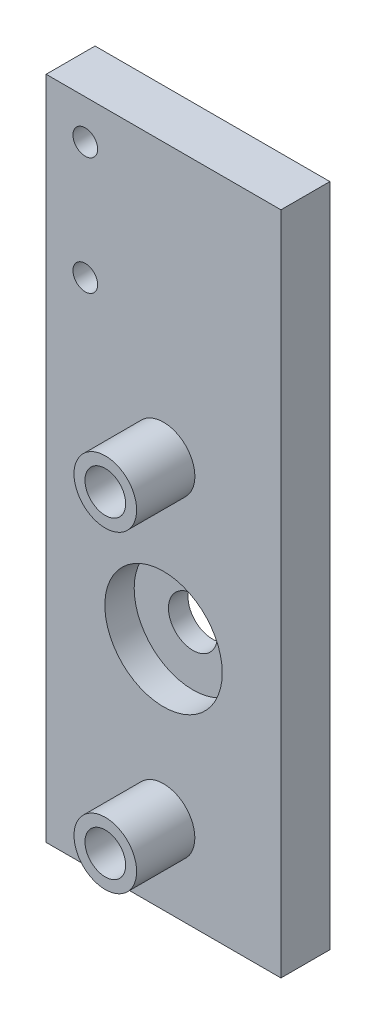
ISO-10303-21;
HEADER;
FILE_DESCRIPTION(('STEP AP214'),'2;1');
FILE_NAME('part.step','',(''),(''),'','','');
FILE_SCHEMA(('AUTOMOTIVE_DESIGN { 1 0 10303 214 1 1 1 1 }'));
ENDSEC;
DATA;
#1=APPLICATION_CONTEXT('core data for automotive mechanical design processes');
#2=APPLICATION_PROTOCOL_DEFINITION('international standard','automotive_design',2000,#1);
#3=PRODUCT_CONTEXT('',#1,'mechanical');
#4=PRODUCT('Part','Part','',(#3));
#5=PRODUCT_RELATED_PRODUCT_CATEGORY('part','',(#4));
#6=PRODUCT_DEFINITION_FORMATION('','',#4);
#7=PRODUCT_DEFINITION_CONTEXT('part definition',#1,'design');
#8=PRODUCT_DEFINITION('design','',#6,#7);
#9=PRODUCT_DEFINITION_SHAPE('','',#8);
#10=(LENGTH_UNIT() NAMED_UNIT(*) SI_UNIT(.MILLI.,.METRE.));
#11=(NAMED_UNIT(*) PLANE_ANGLE_UNIT() SI_UNIT($,.RADIAN.));
#12=(NAMED_UNIT(*) SI_UNIT($,.STERADIAN.) SOLID_ANGLE_UNIT());
#13=UNCERTAINTY_MEASURE_WITH_UNIT(LENGTH_MEASURE(1.E-05),#10,'distance_accuracy_value','');
#14=(GEOMETRIC_REPRESENTATION_CONTEXT(3) GLOBAL_UNCERTAINTY_ASSIGNED_CONTEXT((#13)) GLOBAL_UNIT_ASSIGNED_CONTEXT((#10,
#11,#12)) REPRESENTATION_CONTEXT('',''));
#15=CARTESIAN_POINT('',(0.,0.,0.));
#16=DIRECTION('',(0.,0.,1.));
#17=DIRECTION('',(1.,0.,0.));
#18=AXIS2_PLACEMENT_3D('',#15,#16,#17);
#19=CARTESIAN_POINT('',(19.05,-38.1,7.9375));
#20=DIRECTION('',(-1.,0.,0.));
#21=DIRECTION('',(0.,0.,1.));
#22=AXIS2_PLACEMENT_3D('',#19,#20,#21);
#23=PLANE('',#22);
#24=DIRECTION('',(0.,1.,0.));
#25=VECTOR('',#24,1.);
#26=CARTESIAN_POINT('',(19.05,-38.1,0.));
#27=LINE('',#26,#25);
#28=CARTESIAN_POINT('',(19.05,-38.1,0.));
#29=VERTEX_POINT('',#28);
#30=CARTESIAN_POINT('',(19.05,69.85,0.));
#31=VERTEX_POINT('',#30);
#32=EDGE_CURVE('E77',#29,#31,#27,.T.);
#33=ORIENTED_EDGE('',*,*,#32,.T.);
#34=DIRECTION('',(0.,0.,1.));
#35=VECTOR('',#34,1.);
#36=CARTESIAN_POINT('',(19.05,69.85,-49.5950854420072));
#37=LINE('',#36,#35);
#38=CARTESIAN_POINT('',(19.05,69.85,7.9375));
#39=VERTEX_POINT('',#38);
#40=EDGE_CURVE('E99',#31,#39,#37,.T.);
#41=ORIENTED_EDGE('',*,*,#40,.T.);
#42=DIRECTION('',(0.,1.,0.));
#43=VECTOR('',#42,1.);
#44=CARTESIAN_POINT('',(19.05,-38.1,7.9375));
#45=LINE('',#44,#43);
#46=CARTESIAN_POINT('',(19.05,-38.1,7.9375));
#47=VERTEX_POINT('',#46);
#48=EDGE_CURVE('E91',#47,#39,#45,.T.);
#49=ORIENTED_EDGE('',*,*,#48,.F.);
#50=DIRECTION('',(0.,0.,-1.));
#51=VECTOR('',#50,1.);
#52=CARTESIAN_POINT('',(19.05,-38.1,7.9375));
#53=LINE('',#52,#51);
#54=EDGE_CURVE('E154',#47,#29,#53,.T.);
#55=ORIENTED_EDGE('',*,*,#54,.T.);
#56=EDGE_LOOP('',(#33,#41,#49,#55));
#57=FACE_BOUND('',#56,.T.);
#58=ADVANCED_FACE('F41',(#57),#23,.F.);
#59=CARTESIAN_POINT('',(-19.05,-38.1,7.9375));
#60=DIRECTION('',(1.,0.,0.));
#61=DIRECTION('',(0.,0.,-1.));
#62=AXIS2_PLACEMENT_3D('',#59,#60,#61);
#63=PLANE('',#62);
#64=DIRECTION('',(0.,-1.,0.));
#65=VECTOR('',#64,1.);
#66=CARTESIAN_POINT('',(-19.05,-38.1,0.));
#67=LINE('',#66,#65);
#68=CARTESIAN_POINT('',(-19.05,69.85,0.));
#69=VERTEX_POINT('',#68);
#70=CARTESIAN_POINT('',(-19.05,-38.1,0.));
#71=VERTEX_POINT('',#70);
#72=EDGE_CURVE('E68',#69,#71,#67,.T.);
#73=ORIENTED_EDGE('',*,*,#72,.T.);
#74=DIRECTION('',(0.,0.,-1.));
#75=VECTOR('',#74,1.);
#76=CARTESIAN_POINT('',(-19.05,-38.1,7.9375));
#77=LINE('',#76,#75);
#78=CARTESIAN_POINT('',(-19.05,-38.1,7.9375));
#79=VERTEX_POINT('',#78);
#80=EDGE_CURVE('E49',#79,#71,#77,.T.);
#81=ORIENTED_EDGE('',*,*,#80,.F.);
#82=DIRECTION('',(0.,-1.,0.));
#83=VECTOR('',#82,1.);
#84=CARTESIAN_POINT('',(-19.05,-38.1,7.9375));
#85=LINE('',#84,#83);
#86=CARTESIAN_POINT('',(-19.05,69.85,7.9375));
#87=VERTEX_POINT('',#86);
#88=EDGE_CURVE('E85',#87,#79,#85,.T.);
#89=ORIENTED_EDGE('',*,*,#88,.F.);
#90=DIRECTION('',(0.,0.,1.));
#91=VECTOR('',#90,1.);
#92=CARTESIAN_POINT('',(-19.05,69.85,-49.5950854420072));
#93=LINE('',#92,#91);
#94=EDGE_CURVE('E88',#69,#87,#93,.T.);
#95=ORIENTED_EDGE('',*,*,#94,.F.);
#96=EDGE_LOOP('',(#73,#81,#89,#95));
#97=FACE_BOUND('',#96,.T.);
#98=ADVANCED_FACE('F87',(#97),#63,.F.);
#99=CARTESIAN_POINT('',(-19.05,-38.1,7.9375));
#100=DIRECTION('',(0.,1.,0.));
#101=DIRECTION('',(0.,0.,1.));
#102=AXIS2_PLACEMENT_3D('',#99,#100,#101);
#103=PLANE('',#102);
#104=DIRECTION('',(1.,0.,0.));
#105=VECTOR('',#104,1.);
#106=CARTESIAN_POINT('',(-19.05,-38.1,0.));
#107=LINE('',#106,#105);
#108=EDGE_CURVE('E151',#71,#29,#107,.T.);
#109=ORIENTED_EDGE('',*,*,#108,.T.);
#110=ORIENTED_EDGE('',*,*,#54,.F.);
#111=DIRECTION('',(1.,0.,0.));
#112=VECTOR('',#111,1.);
#113=CARTESIAN_POINT('',(-19.05,-38.1,7.9375));
#114=LINE('',#113,#112);
#115=EDGE_CURVE('E57',#79,#47,#114,.T.);
#116=ORIENTED_EDGE('',*,*,#115,.F.);
#117=ORIENTED_EDGE('',*,*,#80,.T.);
#118=EDGE_LOOP('',(#109,#110,#116,#117));
#119=FACE_BOUND('',#118,.T.);
#120=ADVANCED_FACE('F184',(#119),#103,.F.);
#121=CARTESIAN_POINT('',(0.,0.,7.9375));
#122=DIRECTION('',(0.,0.,-1.));
#123=DIRECTION('',(-1.,0.,0.));
#124=AXIS2_PLACEMENT_3D('',#121,#122,#123);
#125=PLANE('',#124);
#126=CARTESIAN_POINT('',(0.,-25.4,7.9375));
#127=DIRECTION('',(0.,0.,-1.));
#128=DIRECTION('',(1.,0.,0.));
#129=AXIS2_PLACEMENT_3D('',#126,#127,#128);
#130=CIRCLE('',#129,5.08);
#131=CARTESIAN_POINT('',(5.08,-25.4,7.9375));
#132=VERTEX_POINT('',#131);
#133=EDGE_CURVE('E124',#132,#132,#130,.T.);
#134=ORIENTED_EDGE('',*,*,#133,.T.);
#135=EDGE_LOOP('',(#134));
#136=FACE_BOUND('',#135,.T.);
#137=CARTESIAN_POINT('',(0.,25.4,7.9375));
#138=DIRECTION('',(0.,0.,-1.));
#139=DIRECTION('',(-1.,0.,0.));
#140=AXIS2_PLACEMENT_3D('',#137,#138,#139);
#141=CIRCLE('',#140,5.08);
#142=CARTESIAN_POINT('',(-5.08,25.4,7.9375));
#143=VERTEX_POINT('',#142);
#144=EDGE_CURVE('E12',#143,#143,#141,.F.);
#145=ORIENTED_EDGE('',*,*,#144,.F.);
#146=EDGE_LOOP('',(#145));
#147=FACE_BOUND('',#146,.T.);
#148=CARTESIAN_POINT('',(0.,0.,7.9375));
#149=DIRECTION('',(0.,0.,1.));
#150=DIRECTION('',(1.,0.,0.));
#151=AXIS2_PLACEMENT_3D('',#148,#149,#150);
#152=CIRCLE('',#151,9.525);
#153=CARTESIAN_POINT('',(9.525,0.,7.9375));
#154=VERTEX_POINT('',#153);
#155=EDGE_CURVE('E141',#154,#154,#152,.T.);
#156=ORIENTED_EDGE('',*,*,#155,.F.);
#157=EDGE_LOOP('',(#156));
#158=FACE_BOUND('',#157,.T.);
#159=ORIENTED_EDGE('',*,*,#48,.T.);
#160=DIRECTION('',(-1.,0.,0.));
#161=VECTOR('',#160,1.);
#162=CARTESIAN_POINT('',(-19.05,69.85,7.9375));
#163=LINE('',#162,#161);
#164=EDGE_CURVE('E97',#39,#87,#163,.T.);
#165=ORIENTED_EDGE('',*,*,#164,.T.);
#166=ORIENTED_EDGE('',*,*,#88,.T.);
#167=ORIENTED_EDGE('',*,*,#115,.T.);
#168=EDGE_LOOP('',(#159,#165,#166,#167));
#169=FACE_BOUND('',#168,.T.);
#170=CARTESIAN_POINT('',(-12.7,44.45,7.9375));
#171=DIRECTION('',(0.,0.,1.));
#172=DIRECTION('',(-1.,0.,0.));
#173=AXIS2_PLACEMENT_3D('',#170,#171,#172);
#174=CIRCLE('',#173,2.);
#175=CARTESIAN_POINT('',(-14.7,44.45,7.9375));
#176=VERTEX_POINT('',#175);
#177=EDGE_CURVE('E105',#176,#176,#174,.T.);
#178=ORIENTED_EDGE('',*,*,#177,.F.);
#179=EDGE_LOOP('',(#178));
#180=FACE_BOUND('',#179,.T.);
#181=CARTESIAN_POINT('',(-12.7,63.5,7.9375));
#182=DIRECTION('',(0.,0.,1.));
#183=DIRECTION('',(1.,0.,0.));
#184=AXIS2_PLACEMENT_3D('',#181,#182,#183);
#185=CIRCLE('',#184,2.);
#186=CARTESIAN_POINT('',(-10.7,63.5,7.9375));
#187=VERTEX_POINT('',#186);
#188=EDGE_CURVE('E111',#187,#187,#185,.T.);
#189=ORIENTED_EDGE('',*,*,#188,.F.);
#190=EDGE_LOOP('',(#189));
#191=FACE_BOUND('',#190,.T.);
#192=ADVANCED_FACE('F101',(#136,#147,#158,#169,#180,#191),#125,.F.);
#193=CARTESIAN_POINT('',(0.,0.,0.));
#194=DIRECTION('',(0.,0.,-1.));
#195=DIRECTION('',(-1.,0.,0.));
#196=AXIS2_PLACEMENT_3D('',#193,#194,#195);
#197=PLANE('',#196);
#198=CARTESIAN_POINT('',(0.,-25.4,0.));
#199=DIRECTION('',(0.,0.,-1.));
#200=DIRECTION('',(1.,0.,0.));
#201=AXIS2_PLACEMENT_3D('',#198,#199,#200);
#202=CIRCLE('',#201,3.302);
#203=CARTESIAN_POINT('',(3.302,-25.4,0.));
#204=VERTEX_POINT('',#203);
#205=EDGE_CURVE('E121',#204,#204,#202,.T.);
#206=ORIENTED_EDGE('',*,*,#205,.F.);
#207=EDGE_LOOP('',(#206));
#208=FACE_BOUND('',#207,.T.);
#209=CARTESIAN_POINT('',(0.,25.4,0.));
#210=DIRECTION('',(0.,0.,1.));
#211=DIRECTION('',(1.,0.,0.));
#212=AXIS2_PLACEMENT_3D('',#209,#210,#211);
#213=CIRCLE('',#212,3.302);
#214=CARTESIAN_POINT('',(3.302,25.4,0.));
#215=VERTEX_POINT('',#214);
#216=EDGE_CURVE('E133',#215,#215,#213,.T.);
#217=ORIENTED_EDGE('',*,*,#216,.T.);
#218=EDGE_LOOP('',(#217));
#219=FACE_BOUND('',#218,.T.);
#220=CARTESIAN_POINT('',(0.,0.,0.));
#221=DIRECTION('',(0.,0.,1.));
#222=DIRECTION('',(1.,0.,0.));
#223=AXIS2_PLACEMENT_3D('',#220,#221,#222);
#224=CIRCLE('',#223,3.96875);
#225=CARTESIAN_POINT('',(3.96875,0.,0.));
#226=VERTEX_POINT('',#225);
#227=EDGE_CURVE('E148',#226,#226,#224,.T.);
#228=ORIENTED_EDGE('',*,*,#227,.T.);
#229=EDGE_LOOP('',(#228));
#230=FACE_BOUND('',#229,.T.);
#231=ORIENTED_EDGE('',*,*,#32,.F.);
#232=ORIENTED_EDGE('',*,*,#108,.F.);
#233=ORIENTED_EDGE('',*,*,#72,.F.);
#234=DIRECTION('',(-1.,0.,0.));
#235=VECTOR('',#234,1.);
#236=CARTESIAN_POINT('',(-19.05,69.85,0.));
#237=LINE('',#236,#235);
#238=EDGE_CURVE('E98',#31,#69,#237,.T.);
#239=ORIENTED_EDGE('',*,*,#238,.F.);
#240=EDGE_LOOP('',(#231,#232,#233,#239));
#241=FACE_BOUND('',#240,.T.);
#242=CARTESIAN_POINT('',(-12.7,44.45,0.));
#243=DIRECTION('',(0.,0.,-1.));
#244=DIRECTION('',(-1.,0.,0.));
#245=AXIS2_PLACEMENT_3D('',#242,#243,#244);
#246=CIRCLE('',#245,2.);
#247=CARTESIAN_POINT('',(-14.7,44.45,0.));
#248=VERTEX_POINT('',#247);
#249=EDGE_CURVE('E104',#248,#248,#246,.F.);
#250=ORIENTED_EDGE('',*,*,#249,.T.);
#251=EDGE_LOOP('',(#250));
#252=FACE_BOUND('',#251,.T.);
#253=CARTESIAN_POINT('',(-12.7,63.5,0.));
#254=DIRECTION('',(0.,0.,-1.));
#255=DIRECTION('',(-1.,0.,0.));
#256=AXIS2_PLACEMENT_3D('',#253,#254,#255);
#257=CIRCLE('',#256,2.);
#258=CARTESIAN_POINT('',(-14.7,63.5,0.));
#259=VERTEX_POINT('',#258);
#260=EDGE_CURVE('E108',#259,#259,#257,.F.);
#261=ORIENTED_EDGE('',*,*,#260,.T.);
#262=EDGE_LOOP('',(#261));
#263=FACE_BOUND('',#262,.T.);
#264=ADVANCED_FACE('F177',(#208,#219,#230,#241,#252,#263),#197,.T.);
#265=CARTESIAN_POINT('',(0.,0.,0.));
#266=DIRECTION('',(0.,0.,1.));
#267=DIRECTION('',(1.,0.,0.));
#268=AXIS2_PLACEMENT_3D('',#265,#266,#267);
#269=CYLINDRICAL_SURFACE('',#268,3.96875);
#270=CARTESIAN_POINT('',(0.,0.,3.175));
#271=DIRECTION('',(0.,0.,-1.));
#272=DIRECTION('',(-1.,0.,0.));
#273=AXIS2_PLACEMENT_3D('',#270,#271,#272);
#274=CIRCLE('',#273,3.96875);
#275=CARTESIAN_POINT('',(-3.96875,0.,3.175));
#276=VERTEX_POINT('',#275);
#277=EDGE_CURVE('E147',#276,#276,#274,.F.);
#278=ORIENTED_EDGE('',*,*,#277,.T.);
#279=EDGE_LOOP('',(#278));
#280=FACE_BOUND('',#279,.T.);
#281=ORIENTED_EDGE('',*,*,#227,.F.);
#282=EDGE_LOOP('',(#281));
#283=FACE_BOUND('',#282,.T.);
#284=ADVANCED_FACE('F162',(#280,#283),#269,.F.);
#285=CARTESIAN_POINT('',(0.,0.,3.175));
#286=DIRECTION('',(0.,0.,-1.));
#287=DIRECTION('',(-1.,0.,0.));
#288=AXIS2_PLACEMENT_3D('',#285,#286,#287);
#289=PLANE('',#288);
#290=CARTESIAN_POINT('',(0.,0.,3.175));
#291=DIRECTION('',(0.,0.,-1.));
#292=DIRECTION('',(-1.,0.,0.));
#293=AXIS2_PLACEMENT_3D('',#290,#291,#292);
#294=CIRCLE('',#293,9.525);
#295=CARTESIAN_POINT('',(-9.525,0.,3.175));
#296=VERTEX_POINT('',#295);
#297=EDGE_CURVE('E144',#296,#296,#294,.F.);
#298=ORIENTED_EDGE('',*,*,#297,.T.);
#299=EDGE_LOOP('',(#298));
#300=FACE_BOUND('',#299,.T.);
#301=ORIENTED_EDGE('',*,*,#277,.F.);
#302=EDGE_LOOP('',(#301));
#303=FACE_BOUND('',#302,.T.);
#304=ADVANCED_FACE('F165',(#300,#303),#289,.F.);
#305=CARTESIAN_POINT('',(0.,0.,-26.9407683632075));
#306=DIRECTION('',(0.,0.,1.));
#307=DIRECTION('',(1.,0.,0.));
#308=AXIS2_PLACEMENT_3D('',#305,#306,#307);
#309=CYLINDRICAL_SURFACE('',#308,9.525);
#310=ORIENTED_EDGE('',*,*,#155,.T.);
#311=EDGE_LOOP('',(#310));
#312=FACE_BOUND('',#311,.T.);
#313=ORIENTED_EDGE('',*,*,#297,.F.);
#314=EDGE_LOOP('',(#313));
#315=FACE_BOUND('',#314,.T.);
#316=ADVANCED_FACE('F167',(#312,#315),#309,.F.);
#317=CARTESIAN_POINT('',(0.,25.4,17.3863));
#318=DIRECTION('',(0.,0.,-1.));
#319=DIRECTION('',(-1.,0.,0.));
#320=AXIS2_PLACEMENT_3D('',#317,#318,#319);
#321=CYLINDRICAL_SURFACE('',#320,5.08);
#322=CARTESIAN_POINT('',(0.,25.4,17.3863));
#323=DIRECTION('',(0.,0.,1.));
#324=DIRECTION('',(1.,0.,0.));
#325=AXIS2_PLACEMENT_3D('',#322,#323,#324);
#326=CIRCLE('',#325,5.08);
#327=CARTESIAN_POINT('',(5.08,25.4,17.3863));
#328=VERTEX_POINT('',#327);
#329=EDGE_CURVE('E136',#328,#328,#326,.T.);
#330=ORIENTED_EDGE('',*,*,#329,.F.);
#331=EDGE_LOOP('',(#330));
#332=FACE_BOUND('',#331,.T.);
#333=ORIENTED_EDGE('',*,*,#144,.T.);
#334=EDGE_LOOP('',(#333));
#335=FACE_BOUND('',#334,.T.);
#336=ADVANCED_FACE('F174',(#332,#335),#321,.T.);
#337=CARTESIAN_POINT('',(0.,25.4,17.3863));
#338=DIRECTION('',(0.,0.,1.));
#339=DIRECTION('',(1.,0.,0.));
#340=AXIS2_PLACEMENT_3D('',#337,#338,#339);
#341=PLANE('',#340);
#342=CARTESIAN_POINT('',(0.,25.4,17.3863));
#343=DIRECTION('',(0.,0.,1.));
#344=DIRECTION('',(1.,0.,0.));
#345=AXIS2_PLACEMENT_3D('',#342,#343,#344);
#346=CIRCLE('',#345,3.302);
#347=CARTESIAN_POINT('',(3.302,25.4,17.3863));
#348=VERTEX_POINT('',#347);
#349=EDGE_CURVE('E130',#348,#348,#346,.T.);
#350=ORIENTED_EDGE('',*,*,#349,.F.);
#351=EDGE_LOOP('',(#350));
#352=FACE_BOUND('',#351,.T.);
#353=ORIENTED_EDGE('',*,*,#329,.T.);
#354=EDGE_LOOP('',(#353));
#355=FACE_BOUND('',#354,.T.);
#356=ADVANCED_FACE('F207',(#352,#355),#341,.T.);
#357=CARTESIAN_POINT('',(0.,25.4,0.));
#358=DIRECTION('',(0.,0.,1.));
#359=DIRECTION('',(1.,0.,0.));
#360=AXIS2_PLACEMENT_3D('',#357,#358,#359);
#361=CYLINDRICAL_SURFACE('',#360,3.302);
#362=ORIENTED_EDGE('',*,*,#216,.F.);
#363=EDGE_LOOP('',(#362));
#364=FACE_BOUND('',#363,.T.);
#365=ORIENTED_EDGE('',*,*,#349,.T.);
#366=EDGE_LOOP('',(#365));
#367=FACE_BOUND('',#366,.T.);
#368=ADVANCED_FACE('F213',(#364,#367),#361,.F.);
#369=CARTESIAN_POINT('',(0.,-25.4,17.3863));
#370=DIRECTION('',(0.,0.,-1.));
#371=DIRECTION('',(-1.,0.,0.));
#372=AXIS2_PLACEMENT_3D('',#369,#370,#371);
#373=CYLINDRICAL_SURFACE('',#372,5.08);
#374=CARTESIAN_POINT('',(0.,-25.4,17.3863));
#375=DIRECTION('',(0.,0.,-1.));
#376=DIRECTION('',(1.,0.,0.));
#377=AXIS2_PLACEMENT_3D('',#374,#375,#376);
#378=CIRCLE('',#377,5.08);
#379=CARTESIAN_POINT('',(5.08,-25.4,17.3863));
#380=VERTEX_POINT('',#379);
#381=EDGE_CURVE('E127',#380,#380,#378,.T.);
#382=ORIENTED_EDGE('',*,*,#381,.T.);
#383=EDGE_LOOP('',(#382));
#384=FACE_BOUND('',#383,.T.);
#385=ORIENTED_EDGE('',*,*,#133,.F.);
#386=EDGE_LOOP('',(#385));
#387=FACE_BOUND('',#386,.T.);
#388=ADVANCED_FACE('F220',(#384,#387),#373,.T.);
#389=CARTESIAN_POINT('',(0.,-25.4,17.3863));
#390=DIRECTION('',(0.,0.,1.));
#391=DIRECTION('',(1.,0.,0.));
#392=AXIS2_PLACEMENT_3D('',#389,#390,#391);
#393=PLANE('',#392);
#394=CARTESIAN_POINT('',(0.,-25.4,17.3863));
#395=DIRECTION('',(0.,0.,-1.));
#396=DIRECTION('',(1.,0.,0.));
#397=AXIS2_PLACEMENT_3D('',#394,#395,#396);
#398=CIRCLE('',#397,3.302);
#399=CARTESIAN_POINT('',(3.302,-25.4,17.3863));
#400=VERTEX_POINT('',#399);
#401=EDGE_CURVE('E117',#400,#400,#398,.T.);
#402=ORIENTED_EDGE('',*,*,#401,.T.);
#403=EDGE_LOOP('',(#402));
#404=FACE_BOUND('',#403,.T.);
#405=ORIENTED_EDGE('',*,*,#381,.F.);
#406=EDGE_LOOP('',(#405));
#407=FACE_BOUND('',#406,.T.);
#408=ADVANCED_FACE('F224',(#404,#407),#393,.T.);
#409=CARTESIAN_POINT('',(0.,-25.4,0.));
#410=DIRECTION('',(0.,0.,1.));
#411=DIRECTION('',(1.,0.,0.));
#412=AXIS2_PLACEMENT_3D('',#409,#410,#411);
#413=CYLINDRICAL_SURFACE('',#412,3.302);
#414=ORIENTED_EDGE('',*,*,#205,.T.);
#415=EDGE_LOOP('',(#414));
#416=FACE_BOUND('',#415,.T.);
#417=ORIENTED_EDGE('',*,*,#401,.F.);
#418=EDGE_LOOP('',(#417));
#419=FACE_BOUND('',#418,.T.);
#420=ADVANCED_FACE('F228',(#416,#419),#413,.F.);
#421=CARTESIAN_POINT('',(-19.05,69.85,-49.5950854420072));
#422=DIRECTION('',(0.,1.,0.));
#423=DIRECTION('',(0.,0.,1.));
#424=AXIS2_PLACEMENT_3D('',#421,#422,#423);
#425=PLANE('',#424);
#426=ORIENTED_EDGE('',*,*,#40,.F.);
#427=ORIENTED_EDGE('',*,*,#238,.T.);
#428=ORIENTED_EDGE('',*,*,#94,.T.);
#429=ORIENTED_EDGE('',*,*,#164,.F.);
#430=EDGE_LOOP('',(#426,#427,#428,#429));
#431=FACE_BOUND('',#430,.T.);
#432=ADVANCED_FACE('F96',(#431),#425,.T.);
#433=CARTESIAN_POINT('',(-12.7,63.5,-49.5950854420072));
#434=DIRECTION('',(0.,0.,1.));
#435=DIRECTION('',(1.,0.,0.));
#436=AXIS2_PLACEMENT_3D('',#433,#434,#435);
#437=CYLINDRICAL_SURFACE('',#436,2.);
#438=ORIENTED_EDGE('',*,*,#188,.T.);
#439=EDGE_LOOP('',(#438));
#440=FACE_BOUND('',#439,.T.);
#441=ORIENTED_EDGE('',*,*,#260,.F.);
#442=EDGE_LOOP('',(#441));
#443=FACE_BOUND('',#442,.T.);
#444=ADVANCED_FACE('F235',(#440,#443),#437,.F.);
#445=CARTESIAN_POINT('',(-12.7,44.45,-49.5950854420072));
#446=DIRECTION('',(0.,0.,1.));
#447=DIRECTION('',(1.,0.,0.));
#448=AXIS2_PLACEMENT_3D('',#445,#446,#447);
#449=CYLINDRICAL_SURFACE('',#448,2.);
#450=ORIENTED_EDGE('',*,*,#177,.T.);
#451=EDGE_LOOP('',(#450));
#452=FACE_BOUND('',#451,.T.);
#453=ORIENTED_EDGE('',*,*,#249,.F.);
#454=EDGE_LOOP('',(#453));
#455=FACE_BOUND('',#454,.T.);
#456=ADVANCED_FACE('F232',(#452,#455),#449,.F.);
#457=CLOSED_SHELL('',(#58,#98,#120,#192,#264,#284,#304,#316,#336,#356,#368,#388,#408,#420,#432,
#444,#456));
#458=MANIFOLD_SOLID_BREP('B2',#457);
#459=ADVANCED_BREP_SHAPE_REPRESENTATION('',(#18,#458),#14);
#460=SHAPE_DEFINITION_REPRESENTATION(#9,#459);
ENDSEC;
END-ISO-10303-21;
